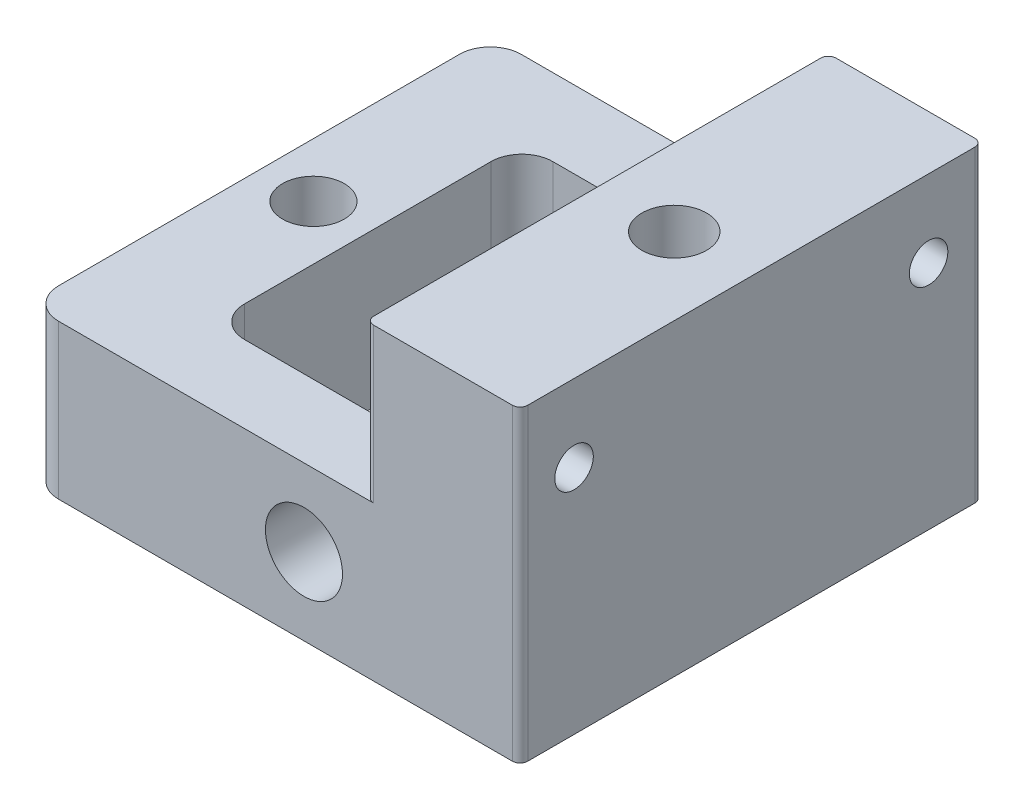
ISO-10303-21;
HEADER;
FILE_DESCRIPTION(('STEP AP214'),'2;1');
FILE_NAME('part.step','',(''),(''),'','','');
FILE_SCHEMA(('AUTOMOTIVE_DESIGN { 1 0 10303 214 1 1 1 1 }'));
ENDSEC;
DATA;
#1=APPLICATION_CONTEXT('core data for automotive mechanical design processes');
#2=APPLICATION_PROTOCOL_DEFINITION('international standard','automotive_design',2000,#1);
#3=PRODUCT_CONTEXT('',#1,'mechanical');
#4=PRODUCT('Part','Part','',(#3));
#5=PRODUCT_RELATED_PRODUCT_CATEGORY('part','',(#4));
#6=PRODUCT_DEFINITION_FORMATION('','',#4);
#7=PRODUCT_DEFINITION_CONTEXT('part definition',#1,'design');
#8=PRODUCT_DEFINITION('design','',#6,#7);
#9=PRODUCT_DEFINITION_SHAPE('','',#8);
#10=(LENGTH_UNIT() NAMED_UNIT(*) SI_UNIT(.MILLI.,.METRE.));
#11=(NAMED_UNIT(*) PLANE_ANGLE_UNIT() SI_UNIT($,.RADIAN.));
#12=(NAMED_UNIT(*) SI_UNIT($,.STERADIAN.) SOLID_ANGLE_UNIT());
#13=UNCERTAINTY_MEASURE_WITH_UNIT(LENGTH_MEASURE(1.E-05),#10,'distance_accuracy_value','');
#14=(GEOMETRIC_REPRESENTATION_CONTEXT(3) GLOBAL_UNCERTAINTY_ASSIGNED_CONTEXT((#13)) GLOBAL_UNIT_ASSIGNED_CONTEXT((#10,
#11,#12)) REPRESENTATION_CONTEXT('',''));
#15=CARTESIAN_POINT('',(0.,0.,0.));
#16=DIRECTION('',(0.,0.,1.));
#17=DIRECTION('',(1.,0.,0.));
#18=AXIS2_PLACEMENT_3D('',#15,#16,#17);
#19=CARTESIAN_POINT('',(5.44,10.,-8.));
#20=DIRECTION('',(0.,1.,0.));
#21=DIRECTION('',(0.,0.,1.));
#22=AXIS2_PLACEMENT_3D('',#19,#20,#21);
#23=CYLINDRICAL_SURFACE('',#22,2.);
#24=CARTESIAN_POINT('',(5.44,3.52704378883824,-10.));
#25=CARTESIAN_POINT('',(5.48104147351789,3.58331500033074,-9.99998850142255));
#26=CARTESIAN_POINT('',(5.51970486579926,3.64128959563261,-9.99873652645845));
#27=CARTESIAN_POINT('',(5.59202875055177,3.7601931502025,-9.99454527256372));
#28=CARTESIAN_POINT('',(5.62569127791035,3.82112089435457,-9.99160668230917));
#29=CARTESIAN_POINT('',(5.68782056180684,3.94556501522876,-9.984832363108));
#30=CARTESIAN_POINT('',(5.71628395876177,4.00908303354357,-9.98099605770029));
#31=CARTESIAN_POINT('',(5.7678176741094,4.13826480713069,-9.97312346739221));
#32=CARTESIAN_POINT('',(5.79088752633298,4.20392874731841,-9.96908716524244));
#33=CARTESIAN_POINT('',(5.8314755973979,4.33696092342867,-9.96142132507083));
#34=CARTESIAN_POINT('',(5.84899488261951,4.4043288292948,-9.95779170900279));
#35=CARTESIAN_POINT('',(5.87836212299287,4.54033165201067,-9.95142638505805));
#36=CARTESIAN_POINT('',(5.89021020499632,4.60896654048525,-9.94869065718759));
#37=CARTESIAN_POINT('',(5.90813180631112,4.74694922186335,-9.944463327643));
#38=CARTESIAN_POINT('',(5.91421163480861,4.81629615180461,-9.94297036687789));
#39=CARTESIAN_POINT('',(5.92056748558876,4.95527106060188,-9.94140819759608));
#40=CARTESIAN_POINT('',(5.92084361097174,5.02489903444328,-9.94133896378746));
#41=CARTESIAN_POINT('',(5.91561008453058,5.16338468110194,-9.9426276082071));
#42=CARTESIAN_POINT('',(5.91014508336507,5.23224415087903,-9.9439744730309));
#43=CARTESIAN_POINT('',(5.89354189799116,5.36926358175334,-9.94791483186192));
#44=CARTESIAN_POINT('',(5.88240156360279,5.43742326773585,-9.9505087983302));
#45=CARTESIAN_POINT('',(5.85452694412536,5.5725723707106,-9.95662231446084));
#46=CARTESIAN_POINT('',(5.83779082199904,5.63956139577792,-9.96014216800098));
#47=CARTESIAN_POINT('',(5.79884920989069,5.7719074873545,-9.96764294093793));
#48=CARTESIAN_POINT('',(5.77664210538313,5.83726406583517,-9.97162399625458));
#49=CARTESIAN_POINT('',(5.71252493957892,6.00306558749418,-9.98174582510828));
#50=CARTESIAN_POINT('',(5.66663571053796,6.10202435352298,-9.98780897311949));
#51=CARTESIAN_POINT('',(5.58846989590418,6.24527103891972,-9.99465155000532));
#52=CARTESIAN_POINT('',(5.56087999802196,6.29212626909717,-9.99655654948567));
#53=CARTESIAN_POINT('',(5.50267870880137,6.38398132372905,-9.99922950587539));
#54=CARTESIAN_POINT('',(5.47206602723758,6.42898034417135,-9.99999697499142));
#55=CARTESIAN_POINT('',(5.44,6.47295621116176,-10.));
#56=B_SPLINE_CURVE_WITH_KNOTS('',3,(#24,#25,#26,#27,#28,#29,#30,#31,#32,#33,#34,#35,#36,#37,#38,
#39,#40,#41,#42,#43,#44,#45,#46,#47,#48,#49,#50,#51,#52,#53,#54,#55),.UNSPECIFIED.,.F.,.F.,(4,2,
2,2,2,2,2,2,2,2,2,2,2,2,2,4),(0.,0.208837685711806,0.417590159750949,0.626477052274401,
0.835381992418413,1.04424677317261,1.25310688188606,1.46173827983796,1.67036597153886,
1.87738302443333,2.0844785670484,2.29164216377793,2.49886696933352,2.82552194118329,
2.98864010160041,3.15182818978092),.UNSPECIFIED.);
#57=CARTESIAN_POINT('',(5.44,3.52704378883824,-10.));
#58=VERTEX_POINT('',#57);
#59=CARTESIAN_POINT('',(5.44,6.47295621116176,-10.));
#60=VERTEX_POINT('',#59);
#61=EDGE_CURVE('E185',#58,#60,#56,.T.);
#62=ORIENTED_EDGE('',*,*,#61,.F.);
#63=DIRECTION('',(0.,-1.,0.));
#64=VECTOR('',#63,1.);
#65=CARTESIAN_POINT('',(5.44,10.,-10.));
#66=LINE('',#65,#64);
#67=CARTESIAN_POINT('',(5.44,0.,-10.));
#68=VERTEX_POINT('',#67);
#69=EDGE_CURVE('E194',#68,#58,#66,.F.);
#70=ORIENTED_EDGE('',*,*,#69,.F.);
#71=CARTESIAN_POINT('',(5.44,0.,-8.));
#72=DIRECTION('',(0.,1.,0.));
#73=DIRECTION('',(0.,0.,1.));
#74=AXIS2_PLACEMENT_3D('',#71,#72,#73);
#75=CIRCLE('',#74,2.);
#76=CARTESIAN_POINT('',(7.44,0.,-8.));
#77=VERTEX_POINT('',#76);
#78=EDGE_CURVE('E226',#77,#68,#75,.T.);
#79=ORIENTED_EDGE('',*,*,#78,.F.);
#80=DIRECTION('',(0.,-1.,0.));
#81=VECTOR('',#80,1.);
#82=CARTESIAN_POINT('',(7.44,0.,-8.));
#83=LINE('',#82,#81);
#84=CARTESIAN_POINT('',(7.44,10.,-8.));
#85=VERTEX_POINT('',#84);
#86=EDGE_CURVE('E215',#85,#77,#83,.T.);
#87=ORIENTED_EDGE('',*,*,#86,.F.);
#88=CARTESIAN_POINT('',(5.44,10.,-8.));
#89=DIRECTION('',(0.,1.,0.));
#90=DIRECTION('',(0.,0.,1.));
#91=AXIS2_PLACEMENT_3D('',#88,#89,#90);
#92=CIRCLE('',#91,2.);
#93=CARTESIAN_POINT('',(5.44,10.,-10.));
#94=VERTEX_POINT('',#93);
#95=EDGE_CURVE('E228',#94,#85,#92,.F.);
#96=ORIENTED_EDGE('',*,*,#95,.F.);
#97=EDGE_CURVE('E196',#60,#94,#66,.F.);
#98=ORIENTED_EDGE('',*,*,#97,.F.);
#99=EDGE_LOOP('',(#62,#70,#79,#87,#96,#98));
#100=FACE_BOUND('',#99,.T.);
#101=ADVANCED_FACE('F35',(#100),#23,.F.);
#102=CARTESIAN_POINT('',(5.44,10.,8.));
#103=DIRECTION('',(0.,1.,0.));
#104=DIRECTION('',(0.,0.,1.));
#105=AXIS2_PLACEMENT_3D('',#102,#103,#104);
#106=CYLINDRICAL_SURFACE('',#105,2.);
#107=CARTESIAN_POINT('',(5.44,6.47295621116176,10.));
#108=CARTESIAN_POINT('',(5.48104147351789,6.41668499966926,9.99998850142255));
#109=CARTESIAN_POINT('',(5.51970486579926,6.35871040436738,9.99873652645846));
#110=CARTESIAN_POINT('',(5.59202875055177,6.2398068497975,9.99454527256372));
#111=CARTESIAN_POINT('',(5.62569127791035,6.17887910564542,9.99160668230917));
#112=CARTESIAN_POINT('',(5.68782056180684,6.05443498477124,9.984832363108));
#113=CARTESIAN_POINT('',(5.71628395876177,5.99091696645643,9.98099605770029));
#114=CARTESIAN_POINT('',(5.7678176741094,5.86173519286931,9.97312346739221));
#115=CARTESIAN_POINT('',(5.79088752633298,5.79607125268159,9.96908716524244));
#116=CARTESIAN_POINT('',(5.8314755973979,5.66303907657133,9.96142132507083));
#117=CARTESIAN_POINT('',(5.84899488261951,5.59567117070519,9.95779170900279));
#118=CARTESIAN_POINT('',(5.87836212299287,5.45966834798933,9.95142638505806));
#119=CARTESIAN_POINT('',(5.89021020499632,5.39103345951475,9.94869065718759));
#120=CARTESIAN_POINT('',(5.90813180631112,5.25305077813665,9.94446332764301));
#121=CARTESIAN_POINT('',(5.91421163480861,5.18370384819539,9.9429703668779));
#122=CARTESIAN_POINT('',(5.92056748558876,5.04472893939812,9.94140819759608));
#123=CARTESIAN_POINT('',(5.92084361097174,4.97510096555672,9.94133896378746));
#124=CARTESIAN_POINT('',(5.91561008453058,4.83661531889805,9.9426276082071));
#125=CARTESIAN_POINT('',(5.91014508336507,4.76775584912096,9.9439744730309));
#126=CARTESIAN_POINT('',(5.89354189799116,4.63073641824666,9.94791483186192));
#127=CARTESIAN_POINT('',(5.88240156360279,4.56257673226415,9.9505087983302));
#128=CARTESIAN_POINT('',(5.85452694412536,4.42742762928939,9.95662231446084));
#129=CARTESIAN_POINT('',(5.83779082199904,4.36043860422207,9.96014216800098));
#130=CARTESIAN_POINT('',(5.79884920989069,4.2280925126455,9.96764294093793));
#131=CARTESIAN_POINT('',(5.77664210538313,4.16273593416482,9.97162399625458));
#132=CARTESIAN_POINT('',(5.71252493957892,3.99693441250582,9.98174582510828));
#133=CARTESIAN_POINT('',(5.66663571053796,3.89797564647702,9.98780897311949));
#134=CARTESIAN_POINT('',(5.58846989590418,3.75472896108028,9.99465155000532));
#135=CARTESIAN_POINT('',(5.56087999802196,3.70787373090283,9.99655654948567));
#136=CARTESIAN_POINT('',(5.50267870880137,3.61601867627095,9.99922950587539));
#137=CARTESIAN_POINT('',(5.47206602723758,3.57101965582865,9.99999697499142));
#138=CARTESIAN_POINT('',(5.44,3.52704378883824,10.));
#139=B_SPLINE_CURVE_WITH_KNOTS('',3,(#107,#108,#109,#110,#111,#112,#113,#114,#115,#116,#117,
#118,#119,#120,#121,#122,#123,#124,#125,#126,#127,#128,#129,#130,#131,#132,#133,#134,#135,#136,
#137,#138),.UNSPECIFIED.,.F.,.F.,(4,2,2,2,2,2,2,2,2,2,2,2,2,2,2,4),(0.,0.208837685711806,
0.417590159750949,0.626477052274402,0.835381992418414,1.04424677317261,1.25310688188606,
1.46173827983796,1.67036597153886,1.87738302443333,2.0844785670484,2.29164216377793,
2.49886696933352,2.82552194118329,2.98864010160041,3.15182818978092),.UNSPECIFIED.);
#140=CARTESIAN_POINT('',(5.44,6.47295621116176,10.));
#141=VERTEX_POINT('',#140);
#142=CARTESIAN_POINT('',(5.44,3.52704378883824,10.));
#143=VERTEX_POINT('',#142);
#144=EDGE_CURVE('E235',#141,#143,#139,.T.);
#145=ORIENTED_EDGE('',*,*,#144,.F.);
#146=DIRECTION('',(0.,-1.,0.));
#147=VECTOR('',#146,1.);
#148=CARTESIAN_POINT('',(5.44,0.,10.));
#149=LINE('',#148,#147);
#150=CARTESIAN_POINT('',(5.44,10.,10.));
#151=VERTEX_POINT('',#150);
#152=EDGE_CURVE('E425',#151,#141,#149,.T.);
#153=ORIENTED_EDGE('',*,*,#152,.F.);
#154=CARTESIAN_POINT('',(5.44,10.,8.));
#155=DIRECTION('',(0.,1.,0.));
#156=DIRECTION('',(0.,0.,1.));
#157=AXIS2_PLACEMENT_3D('',#154,#155,#156);
#158=CIRCLE('',#157,2.);
#159=CARTESIAN_POINT('',(7.44000000000001,10.,7.99999999999999));
#160=VERTEX_POINT('',#159);
#161=EDGE_CURVE('E233',#160,#151,#158,.F.);
#162=ORIENTED_EDGE('',*,*,#161,.F.);
#163=DIRECTION('',(0.,-1.,0.));
#164=VECTOR('',#163,1.);
#165=CARTESIAN_POINT('',(7.44,10.,8.));
#166=LINE('',#165,#164);
#167=CARTESIAN_POINT('',(7.44,0.,8.));
#168=VERTEX_POINT('',#167);
#169=EDGE_CURVE('E207',#168,#160,#166,.F.);
#170=ORIENTED_EDGE('',*,*,#169,.F.);
#171=CARTESIAN_POINT('',(5.44,0.,8.));
#172=DIRECTION('',(0.,1.,0.));
#173=DIRECTION('',(0.,0.,1.));
#174=AXIS2_PLACEMENT_3D('',#171,#172,#173);
#175=CIRCLE('',#174,2.);
#176=CARTESIAN_POINT('',(5.44,0.,10.));
#177=VERTEX_POINT('',#176);
#178=EDGE_CURVE('E231',#177,#168,#175,.T.);
#179=ORIENTED_EDGE('',*,*,#178,.F.);
#180=EDGE_CURVE('E424',#143,#177,#149,.T.);
#181=ORIENTED_EDGE('',*,*,#180,.F.);
#182=EDGE_LOOP('',(#145,#153,#162,#170,#179,#181));
#183=FACE_BOUND('',#182,.T.);
#184=ADVANCED_FACE('F245',(#183),#106,.F.);
#185=CARTESIAN_POINT('',(0.,10.,0.));
#186=DIRECTION('',(0.,1.,0.));
#187=DIRECTION('',(0.,0.,1.));
#188=AXIS2_PLACEMENT_3D('',#185,#186,#187);
#189=PLANE('',#188);
#190=CARTESIAN_POINT('',(-10.965,10.,0.));
#191=DIRECTION('',(0.,1.,0.));
#192=DIRECTION('',(0.,0.,1.));
#193=AXIS2_PLACEMENT_3D('',#190,#191,#192);
#194=CIRCLE('',#193,2.);
#195=CARTESIAN_POINT('',(-10.965,10.,2.));
#196=VERTEX_POINT('',#195);
#197=EDGE_CURVE('E539',#196,#196,#194,.T.);
#198=ORIENTED_EDGE('',*,*,#197,.F.);
#199=EDGE_LOOP('',(#198));
#200=FACE_BOUND('',#199,.T.);
#201=DIRECTION('',(-1.,0.,0.));
#202=VECTOR('',#201,1.);
#203=CARTESIAN_POINT('',(17.44,10.,-15.));
#204=LINE('',#203,#202);
#205=CARTESIAN_POINT('',(7.94,10.,-15.));
#206=VERTEX_POINT('',#205);
#207=CARTESIAN_POINT('',(-12.49,10.,-15.));
#208=VERTEX_POINT('',#207);
#209=EDGE_CURVE('E365',#206,#208,#204,.T.);
#210=ORIENTED_EDGE('',*,*,#209,.T.);
#211=CARTESIAN_POINT('',(-12.49,10.,-13.));
#212=DIRECTION('',(0.,1.,0.));
#213=DIRECTION('',(0.,0.,1.));
#214=AXIS2_PLACEMENT_3D('',#211,#212,#213);
#215=CIRCLE('',#214,2.);
#216=CARTESIAN_POINT('',(-14.49,10.,-13.));
#217=VERTEX_POINT('',#216);
#218=EDGE_CURVE('E467',#208,#217,#215,.T.);
#219=ORIENTED_EDGE('',*,*,#218,.T.);
#220=DIRECTION('',(0.,0.,1.));
#221=VECTOR('',#220,1.);
#222=CARTESIAN_POINT('',(-14.49,10.,15.));
#223=LINE('',#222,#221);
#224=CARTESIAN_POINT('',(-14.49,10.,13.));
#225=VERTEX_POINT('',#224);
#226=EDGE_CURVE('E404',#217,#225,#223,.T.);
#227=ORIENTED_EDGE('',*,*,#226,.T.);
#228=CARTESIAN_POINT('',(-12.49,10.,13.));
#229=DIRECTION('',(0.,1.,0.));
#230=DIRECTION('',(0.,0.,1.));
#231=AXIS2_PLACEMENT_3D('',#228,#229,#230);
#232=CIRCLE('',#231,2.);
#233=CARTESIAN_POINT('',(-12.49,10.,15.));
#234=VERTEX_POINT('',#233);
#235=EDGE_CURVE('E469',#225,#234,#232,.T.);
#236=ORIENTED_EDGE('',*,*,#235,.T.);
#237=DIRECTION('',(1.,0.,0.));
#238=VECTOR('',#237,1.);
#239=CARTESIAN_POINT('',(17.44,10.,15.));
#240=LINE('',#239,#238);
#241=CARTESIAN_POINT('',(7.94,10.,15.));
#242=VERTEX_POINT('',#241);
#243=EDGE_CURVE('E407',#234,#242,#240,.T.);
#244=ORIENTED_EDGE('',*,*,#243,.T.);
#245=CARTESIAN_POINT('',(7.94,10.,14.5));
#246=DIRECTION('',(0.,1.,0.));
#247=DIRECTION('',(0.,0.,1.));
#248=AXIS2_PLACEMENT_3D('',#245,#246,#247);
#249=CIRCLE('',#248,0.5);
#250=CARTESIAN_POINT('',(7.44000000000001,10.,14.5));
#251=VERTEX_POINT('',#250);
#252=EDGE_CURVE('E12',#242,#251,#249,.F.);
#253=ORIENTED_EDGE('',*,*,#252,.T.);
#254=DIRECTION('',(0.,0.,1.));
#255=VECTOR('',#254,1.);
#256=CARTESIAN_POINT('',(7.44,10.,-15.));
#257=LINE('',#256,#255);
#258=EDGE_CURVE('E384',#160,#251,#257,.T.);
#259=ORIENTED_EDGE('',*,*,#258,.F.);
#260=ORIENTED_EDGE('',*,*,#161,.T.);
#261=DIRECTION('',(1.,0.,0.));
#262=VECTOR('',#261,1.);
#263=CARTESIAN_POINT('',(7.44,10.,10.));
#264=LINE('',#263,#262);
#265=CARTESIAN_POINT('',(-5.44,10.,10.));
#266=VERTEX_POINT('',#265);
#267=EDGE_CURVE('E388',#266,#151,#264,.T.);
#268=ORIENTED_EDGE('',*,*,#267,.F.);
#269=CARTESIAN_POINT('',(-5.44,10.,8.00000000000001));
#270=DIRECTION('',(0.,1.,0.));
#271=DIRECTION('',(0.,0.,1.));
#272=AXIS2_PLACEMENT_3D('',#269,#270,#271);
#273=CIRCLE('',#272,2.);
#274=CARTESIAN_POINT('',(-7.44,10.,8.00000000000001));
#275=VERTEX_POINT('',#274);
#276=EDGE_CURVE('E220',#266,#275,#273,.F.);
#277=ORIENTED_EDGE('',*,*,#276,.T.);
#278=DIRECTION('',(0.,0.,1.));
#279=VECTOR('',#278,1.);
#280=CARTESIAN_POINT('',(-7.44,10.,10.));
#281=LINE('',#280,#279);
#282=CARTESIAN_POINT('',(-7.44,10.,-8.));
#283=VERTEX_POINT('',#282);
#284=EDGE_CURVE('E385',#283,#275,#281,.T.);
#285=ORIENTED_EDGE('',*,*,#284,.F.);
#286=CARTESIAN_POINT('',(-5.44,10.,-7.99999999999999));
#287=DIRECTION('',(0.,1.,0.));
#288=DIRECTION('',(0.,0.,1.));
#289=AXIS2_PLACEMENT_3D('',#286,#287,#288);
#290=CIRCLE('',#289,2.);
#291=CARTESIAN_POINT('',(-5.44,10.,-9.99999999999999));
#292=VERTEX_POINT('',#291);
#293=EDGE_CURVE('E224',#283,#292,#290,.F.);
#294=ORIENTED_EDGE('',*,*,#293,.T.);
#295=DIRECTION('',(-1.,0.,0.));
#296=VECTOR('',#295,1.);
#297=CARTESIAN_POINT('',(7.44,10.,-10.));
#298=LINE('',#297,#296);
#299=EDGE_CURVE('E391',#94,#292,#298,.T.);
#300=ORIENTED_EDGE('',*,*,#299,.F.);
#301=ORIENTED_EDGE('',*,*,#95,.T.);
#302=CARTESIAN_POINT('',(7.44,10.,-14.5));
#303=VERTEX_POINT('',#302);
#304=EDGE_CURVE('E367',#303,#85,#257,.T.);
#305=ORIENTED_EDGE('',*,*,#304,.F.);
#306=CARTESIAN_POINT('',(7.94,10.,-14.5));
#307=DIRECTION('',(0.,1.,0.));
#308=DIRECTION('',(0.,0.,1.));
#309=AXIS2_PLACEMENT_3D('',#306,#307,#308);
#310=CIRCLE('',#309,0.5);
#311=EDGE_CURVE('E43',#303,#206,#310,.F.);
#312=ORIENTED_EDGE('',*,*,#311,.T.);
#313=EDGE_LOOP('',(#210,#219,#227,#236,#244,#253,#259,#260,#268,#277,#285,#294,#300,#301,#305,#312));
#314=FACE_BOUND('',#313,.T.);
#315=ADVANCED_FACE('F298',(#200,#314),#189,.T.);
#316=CARTESIAN_POINT('',(0.,0.,0.));
#317=DIRECTION('',(0.,1.,0.));
#318=DIRECTION('',(0.,0.,1.));
#319=AXIS2_PLACEMENT_3D('',#316,#317,#318);
#320=PLANE('',#319);
#321=CARTESIAN_POINT('',(-10.965,0.,0.));
#322=DIRECTION('',(0.,1.,0.));
#323=DIRECTION('',(0.,0.,1.));
#324=AXIS2_PLACEMENT_3D('',#321,#322,#323);
#325=CIRCLE('',#324,2.);
#326=CARTESIAN_POINT('',(-10.965,0.,2.));
#327=VERTEX_POINT('',#326);
#328=EDGE_CURVE('E536',#327,#327,#325,.T.);
#329=ORIENTED_EDGE('',*,*,#328,.T.);
#330=EDGE_LOOP('',(#329));
#331=FACE_BOUND('',#330,.T.);
#332=CARTESIAN_POINT('',(12.44,0.,0.));
#333=DIRECTION('',(0.,1.,0.));
#334=DIRECTION('',(0.,0.,1.));
#335=AXIS2_PLACEMENT_3D('',#332,#333,#334);
#336=CIRCLE('',#335,2.1);
#337=CARTESIAN_POINT('',(12.44,0.,2.1));
#338=VERTEX_POINT('',#337);
#339=EDGE_CURVE('E383',#338,#338,#336,.T.);
#340=ORIENTED_EDGE('',*,*,#339,.T.);
#341=EDGE_LOOP('',(#340));
#342=FACE_BOUND('',#341,.T.);
#343=DIRECTION('',(0.,0.,-1.));
#344=VECTOR('',#343,1.);
#345=CARTESIAN_POINT('',(17.44,0.,15.));
#346=LINE('',#345,#344);
#347=CARTESIAN_POINT('',(17.44,0.,14.5));
#348=VERTEX_POINT('',#347);
#349=CARTESIAN_POINT('',(17.44,0.,-14.5));
#350=VERTEX_POINT('',#349);
#351=EDGE_CURVE('E416',#348,#350,#346,.T.);
#352=ORIENTED_EDGE('',*,*,#351,.F.);
#353=CARTESIAN_POINT('',(16.94,0.,14.5));
#354=DIRECTION('',(0.,1.,0.));
#355=DIRECTION('',(0.,0.,1.));
#356=AXIS2_PLACEMENT_3D('',#353,#354,#355);
#357=CIRCLE('',#356,0.5);
#358=CARTESIAN_POINT('',(16.94,0.,15.));
#359=VERTEX_POINT('',#358);
#360=EDGE_CURVE('E457',#348,#359,#357,.F.);
#361=ORIENTED_EDGE('',*,*,#360,.T.);
#362=DIRECTION('',(1.,0.,0.));
#363=VECTOR('',#362,1.);
#364=CARTESIAN_POINT('',(17.44,0.,15.));
#365=LINE('',#364,#363);
#366=CARTESIAN_POINT('',(-12.49,0.,15.));
#367=VERTEX_POINT('',#366);
#368=EDGE_CURVE('E413',#367,#359,#365,.T.);
#369=ORIENTED_EDGE('',*,*,#368,.F.);
#370=CARTESIAN_POINT('',(-12.49,0.,13.));
#371=DIRECTION('',(0.,1.,0.));
#372=DIRECTION('',(0.,0.,1.));
#373=AXIS2_PLACEMENT_3D('',#370,#371,#372);
#374=CIRCLE('',#373,2.);
#375=CARTESIAN_POINT('',(-14.49,0.,13.));
#376=VERTEX_POINT('',#375);
#377=EDGE_CURVE('E476',#367,#376,#374,.F.);
#378=ORIENTED_EDGE('',*,*,#377,.T.);
#379=DIRECTION('',(0.,0.,1.));
#380=VECTOR('',#379,1.);
#381=CARTESIAN_POINT('',(-14.49,0.,15.));
#382=LINE('',#381,#380);
#383=CARTESIAN_POINT('',(-14.49,0.,-13.));
#384=VERTEX_POINT('',#383);
#385=EDGE_CURVE('E394',#384,#376,#382,.T.);
#386=ORIENTED_EDGE('',*,*,#385,.F.);
#387=CARTESIAN_POINT('',(-12.49,0.,-13.));
#388=DIRECTION('',(0.,1.,0.));
#389=DIRECTION('',(0.,0.,1.));
#390=AXIS2_PLACEMENT_3D('',#387,#388,#389);
#391=CIRCLE('',#390,2.);
#392=CARTESIAN_POINT('',(-12.49,0.,-15.));
#393=VERTEX_POINT('',#392);
#394=EDGE_CURVE('E473',#384,#393,#391,.F.);
#395=ORIENTED_EDGE('',*,*,#394,.T.);
#396=DIRECTION('',(-1.,0.,0.));
#397=VECTOR('',#396,1.);
#398=CARTESIAN_POINT('',(17.44,0.,-15.));
#399=LINE('',#398,#397);
#400=CARTESIAN_POINT('',(16.94,0.,-15.));
#401=VERTEX_POINT('',#400);
#402=EDGE_CURVE('E408',#401,#393,#399,.T.);
#403=ORIENTED_EDGE('',*,*,#402,.F.);
#404=CARTESIAN_POINT('',(16.94,0.,-14.5));
#405=DIRECTION('',(0.,1.,0.));
#406=DIRECTION('',(0.,0.,1.));
#407=AXIS2_PLACEMENT_3D('',#404,#405,#406);
#408=CIRCLE('',#407,0.5);
#409=EDGE_CURVE('E459',#401,#350,#408,.F.);
#410=ORIENTED_EDGE('',*,*,#409,.T.);
#411=EDGE_LOOP('',(#352,#361,#369,#378,#386,#395,#403,#410));
#412=FACE_BOUND('',#411,.T.);
#413=DIRECTION('',(-1.,0.,0.));
#414=VECTOR('',#413,1.);
#415=CARTESIAN_POINT('',(7.44,0.,-10.));
#416=LINE('',#415,#414);
#417=CARTESIAN_POINT('',(-5.44,0.,-9.99999999999999));
#418=VERTEX_POINT('',#417);
#419=EDGE_CURVE('E204',#68,#418,#416,.T.);
#420=ORIENTED_EDGE('',*,*,#419,.T.);
#421=CARTESIAN_POINT('',(-5.44,0.,-7.99999999999999));
#422=DIRECTION('',(0.,1.,0.));
#423=DIRECTION('',(0.,0.,1.));
#424=AXIS2_PLACEMENT_3D('',#421,#422,#423);
#425=CIRCLE('',#424,2.);
#426=CARTESIAN_POINT('',(-7.44,0.,-8.));
#427=VERTEX_POINT('',#426);
#428=EDGE_CURVE('E222',#418,#427,#425,.T.);
#429=ORIENTED_EDGE('',*,*,#428,.T.);
#430=DIRECTION('',(0.,0.,1.));
#431=VECTOR('',#430,1.);
#432=CARTESIAN_POINT('',(-7.44,0.,10.));
#433=LINE('',#432,#431);
#434=CARTESIAN_POINT('',(-7.44,0.,8.00000000000001));
#435=VERTEX_POINT('',#434);
#436=EDGE_CURVE('E339',#427,#435,#433,.T.);
#437=ORIENTED_EDGE('',*,*,#436,.T.);
#438=CARTESIAN_POINT('',(-5.44,0.,8.00000000000001));
#439=DIRECTION('',(0.,1.,0.));
#440=DIRECTION('',(0.,0.,1.));
#441=AXIS2_PLACEMENT_3D('',#438,#439,#440);
#442=CIRCLE('',#441,2.);
#443=CARTESIAN_POINT('',(-5.44,0.,10.));
#444=VERTEX_POINT('',#443);
#445=EDGE_CURVE('E218',#435,#444,#442,.T.);
#446=ORIENTED_EDGE('',*,*,#445,.T.);
#447=DIRECTION('',(1.,0.,0.));
#448=VECTOR('',#447,1.);
#449=CARTESIAN_POINT('',(7.44,0.,10.));
#450=LINE('',#449,#448);
#451=EDGE_CURVE('E397',#444,#177,#450,.T.);
#452=ORIENTED_EDGE('',*,*,#451,.T.);
#453=ORIENTED_EDGE('',*,*,#178,.T.);
#454=DIRECTION('',(0.,0.,-1.));
#455=VECTOR('',#454,1.);
#456=CARTESIAN_POINT('',(7.44,0.,10.));
#457=LINE('',#456,#455);
#458=EDGE_CURVE('E400',#168,#77,#457,.T.);
#459=ORIENTED_EDGE('',*,*,#458,.T.);
#460=ORIENTED_EDGE('',*,*,#78,.T.);
#461=EDGE_LOOP('',(#420,#429,#437,#446,#452,#453,#459,#460));
#462=FACE_BOUND('',#461,.T.);
#463=ADVANCED_FACE('F282',(#331,#342,#412,#462),#320,.F.);
#464=CARTESIAN_POINT('',(-14.49,10.,15.));
#465=DIRECTION('',(1.,0.,0.));
#466=DIRECTION('',(0.,0.,-1.));
#467=AXIS2_PLACEMENT_3D('',#464,#465,#466);
#468=PLANE('',#467);
#469=ORIENTED_EDGE('',*,*,#226,.F.);
#470=DIRECTION('',(0.,-1.,0.));
#471=VECTOR('',#470,1.);
#472=CARTESIAN_POINT('',(-14.49,10.,-13.));
#473=LINE('',#472,#471);
#474=EDGE_CURVE('E477',#217,#384,#473,.T.);
#475=ORIENTED_EDGE('',*,*,#474,.T.);
#476=ORIENTED_EDGE('',*,*,#385,.T.);
#477=DIRECTION('',(0.,-1.,0.));
#478=VECTOR('',#477,1.);
#479=CARTESIAN_POINT('',(-14.49,10.,13.));
#480=LINE('',#479,#478);
#481=EDGE_CURVE('E243',#376,#225,#480,.F.);
#482=ORIENTED_EDGE('',*,*,#481,.T.);
#483=EDGE_LOOP('',(#469,#475,#476,#482));
#484=FACE_BOUND('',#483,.T.);
#485=ADVANCED_FACE('F278',(#484),#468,.F.);
#486=CARTESIAN_POINT('',(17.44,10.,15.));
#487=DIRECTION('',(0.,0.,-1.));
#488=DIRECTION('',(-1.,0.,0.));
#489=AXIS2_PLACEMENT_3D('',#486,#487,#488);
#490=PLANE('',#489);
#491=CARTESIAN_POINT('',(3.42,5.,15.));
#492=DIRECTION('',(0.,0.,1.));
#493=DIRECTION('',(1.,0.,0.));
#494=AXIS2_PLACEMENT_3D('',#491,#492,#493);
#495=CIRCLE('',#494,2.5);
#496=CARTESIAN_POINT('',(5.92,5.,15.));
#497=VERTEX_POINT('',#496);
#498=EDGE_CURVE('E189',#497,#497,#495,.T.);
#499=ORIENTED_EDGE('',*,*,#498,.F.);
#500=EDGE_LOOP('',(#499));
#501=FACE_BOUND('',#500,.T.);
#502=ORIENTED_EDGE('',*,*,#368,.T.);
#503=DIRECTION('',(0.,-1.,0.));
#504=VECTOR('',#503,1.);
#505=CARTESIAN_POINT('',(16.94,10.,15.));
#506=LINE('',#505,#504);
#507=CARTESIAN_POINT('',(16.94,20.,15.));
#508=VERTEX_POINT('',#507);
#509=EDGE_CURVE('E346',#359,#508,#506,.F.);
#510=ORIENTED_EDGE('',*,*,#509,.T.);
#511=DIRECTION('',(1.,0.,0.));
#512=VECTOR('',#511,1.);
#513=CARTESIAN_POINT('',(17.44,20.,15.));
#514=LINE('',#513,#512);
#515=CARTESIAN_POINT('',(7.94,20.,15.));
#516=VERTEX_POINT('',#515);
#517=EDGE_CURVE('E328',#516,#508,#514,.T.);
#518=ORIENTED_EDGE('',*,*,#517,.F.);
#519=DIRECTION('',(0.,-1.,0.));
#520=VECTOR('',#519,1.);
#521=CARTESIAN_POINT('',(7.94,10.,15.));
#522=LINE('',#521,#520);
#523=EDGE_CURVE('E452',#516,#242,#522,.T.);
#524=ORIENTED_EDGE('',*,*,#523,.T.);
#525=ORIENTED_EDGE('',*,*,#243,.F.);
#526=DIRECTION('',(0.,-1.,0.));
#527=VECTOR('',#526,1.);
#528=CARTESIAN_POINT('',(-12.49,10.,15.));
#529=LINE('',#528,#527);
#530=EDGE_CURVE('E464',#234,#367,#529,.T.);
#531=ORIENTED_EDGE('',*,*,#530,.T.);
#532=EDGE_LOOP('',(#502,#510,#518,#524,#525,#531));
#533=FACE_BOUND('',#532,.T.);
#534=ADVANCED_FACE('F281',(#501,#533),#490,.F.);
#535=CARTESIAN_POINT('',(17.44,10.,15.));
#536=DIRECTION('',(-1.,0.,0.));
#537=DIRECTION('',(0.,0.,1.));
#538=AXIS2_PLACEMENT_3D('',#535,#536,#537);
#539=PLANE('',#538);
#540=CARTESIAN_POINT('',(17.44,15.,-11.5));
#541=DIRECTION('',(-1.,0.,0.));
#542=DIRECTION('',(0.,0.,1.));
#543=AXIS2_PLACEMENT_3D('',#540,#541,#542);
#544=CIRCLE('',#543,1.25);
#545=CARTESIAN_POINT('',(17.44,15.,-10.25));
#546=VERTEX_POINT('',#545);
#547=EDGE_CURVE('E546',#546,#546,#544,.T.);
#548=ORIENTED_EDGE('',*,*,#547,.T.);
#549=EDGE_LOOP('',(#548));
#550=FACE_BOUND('',#549,.T.);
#551=CARTESIAN_POINT('',(17.44,15.,11.5));
#552=DIRECTION('',(-1.,0.,0.));
#553=DIRECTION('',(0.,0.,1.));
#554=AXIS2_PLACEMENT_3D('',#551,#552,#553);
#555=CIRCLE('',#554,1.25);
#556=CARTESIAN_POINT('',(17.44,15.,12.75));
#557=VERTEX_POINT('',#556);
#558=EDGE_CURVE('E552',#557,#557,#555,.T.);
#559=ORIENTED_EDGE('',*,*,#558,.T.);
#560=EDGE_LOOP('',(#559));
#561=FACE_BOUND('',#560,.T.);
#562=DIRECTION('',(0.,0.,-1.));
#563=VECTOR('',#562,1.);
#564=CARTESIAN_POINT('',(17.44,20.,-15.));
#565=LINE('',#564,#563);
#566=CARTESIAN_POINT('',(17.44,20.,14.5));
#567=VERTEX_POINT('',#566);
#568=CARTESIAN_POINT('',(17.44,20.,-14.5));
#569=VERTEX_POINT('',#568);
#570=EDGE_CURVE('E377',#567,#569,#565,.T.);
#571=ORIENTED_EDGE('',*,*,#570,.F.);
#572=DIRECTION('',(0.,-1.,0.));
#573=VECTOR('',#572,1.);
#574=CARTESIAN_POINT('',(17.44,10.,14.5));
#575=LINE('',#574,#573);
#576=EDGE_CURVE('E348',#567,#348,#575,.T.);
#577=ORIENTED_EDGE('',*,*,#576,.T.);
#578=ORIENTED_EDGE('',*,*,#351,.T.);
#579=DIRECTION('',(0.,-1.,0.));
#580=VECTOR('',#579,1.);
#581=CARTESIAN_POINT('',(17.44,10.,-14.5));
#582=LINE('',#581,#580);
#583=EDGE_CURVE('E462',#350,#569,#582,.F.);
#584=ORIENTED_EDGE('',*,*,#583,.T.);
#585=EDGE_LOOP('',(#571,#577,#578,#584));
#586=FACE_BOUND('',#585,.T.);
#587=ADVANCED_FACE('F286',(#550,#561,#586),#539,.F.);
#588=CARTESIAN_POINT('',(17.44,10.,-15.));
#589=DIRECTION('',(0.,0.,1.));
#590=DIRECTION('',(1.,0.,0.));
#591=AXIS2_PLACEMENT_3D('',#588,#589,#590);
#592=PLANE('',#591);
#593=CARTESIAN_POINT('',(3.42,5.,-15.));
#594=DIRECTION('',(0.,0.,1.));
#595=DIRECTION('',(1.,0.,0.));
#596=AXIS2_PLACEMENT_3D('',#593,#594,#595);
#597=CIRCLE('',#596,1.65);
#598=CARTESIAN_POINT('',(5.07,5.,-15.));
#599=VERTEX_POINT('',#598);
#600=EDGE_CURVE('E190',#599,#599,#597,.T.);
#601=ORIENTED_EDGE('',*,*,#600,.T.);
#602=EDGE_LOOP('',(#601));
#603=FACE_BOUND('',#602,.T.);
#604=DIRECTION('',(-1.,0.,0.));
#605=VECTOR('',#604,1.);
#606=CARTESIAN_POINT('',(17.44,20.,-15.));
#607=LINE('',#606,#605);
#608=CARTESIAN_POINT('',(16.94,20.,-15.));
#609=VERTEX_POINT('',#608);
#610=CARTESIAN_POINT('',(7.94,20.,-15.));
#611=VERTEX_POINT('',#610);
#612=EDGE_CURVE('E373',#609,#611,#607,.T.);
#613=ORIENTED_EDGE('',*,*,#612,.F.);
#614=DIRECTION('',(0.,-1.,0.));
#615=VECTOR('',#614,1.);
#616=CARTESIAN_POINT('',(16.94,10.,-15.));
#617=LINE('',#616,#615);
#618=EDGE_CURVE('E352',#609,#401,#617,.T.);
#619=ORIENTED_EDGE('',*,*,#618,.T.);
#620=ORIENTED_EDGE('',*,*,#402,.T.);
#621=DIRECTION('',(0.,-1.,0.));
#622=VECTOR('',#621,1.);
#623=CARTESIAN_POINT('',(-12.49,10.,-15.));
#624=LINE('',#623,#622);
#625=EDGE_CURVE('E471',#393,#208,#624,.F.);
#626=ORIENTED_EDGE('',*,*,#625,.T.);
#627=ORIENTED_EDGE('',*,*,#209,.F.);
#628=DIRECTION('',(0.,-1.,0.));
#629=VECTOR('',#628,1.);
#630=CARTESIAN_POINT('',(7.94,20.,-15.));
#631=LINE('',#630,#629);
#632=EDGE_CURVE('E349',#206,#611,#631,.F.);
#633=ORIENTED_EDGE('',*,*,#632,.T.);
#634=EDGE_LOOP('',(#613,#619,#620,#626,#627,#633));
#635=FACE_BOUND('',#634,.T.);
#636=ADVANCED_FACE('F290',(#603,#635),#592,.F.);
#637=CARTESIAN_POINT('',(-7.44,10.,10.));
#638=DIRECTION('',(1.,0.,0.));
#639=DIRECTION('',(0.,0.,-1.));
#640=AXIS2_PLACEMENT_3D('',#637,#638,#639);
#641=PLANE('',#640);
#642=ORIENTED_EDGE('',*,*,#284,.T.);
#643=DIRECTION('',(0.,-1.,0.));
#644=VECTOR('',#643,1.);
#645=CARTESIAN_POINT('',(-7.44,0.,8.00000000000001));
#646=LINE('',#645,#644);
#647=EDGE_CURVE('E422',#275,#435,#646,.T.);
#648=ORIENTED_EDGE('',*,*,#647,.T.);
#649=ORIENTED_EDGE('',*,*,#436,.F.);
#650=DIRECTION('',(0.,-1.,0.));
#651=VECTOR('',#650,1.);
#652=CARTESIAN_POINT('',(-7.44,10.,-7.99999999999999));
#653=LINE('',#652,#651);
#654=EDGE_CURVE('E420',#427,#283,#653,.F.);
#655=ORIENTED_EDGE('',*,*,#654,.T.);
#656=EDGE_LOOP('',(#642,#648,#649,#655));
#657=FACE_BOUND('',#656,.T.);
#658=ADVANCED_FACE('F294',(#657),#641,.T.);
#659=CARTESIAN_POINT('',(7.44,10.,10.));
#660=DIRECTION('',(0.,0.,-1.));
#661=DIRECTION('',(-1.,0.,0.));
#662=AXIS2_PLACEMENT_3D('',#659,#660,#661);
#663=PLANE('',#662);
#664=ORIENTED_EDGE('',*,*,#152,.T.);
#665=CARTESIAN_POINT('',(3.42,5.,10.));
#666=DIRECTION('',(0.,0.,-1.));
#667=DIRECTION('',(-1.,0.,0.));
#668=AXIS2_PLACEMENT_3D('',#665,#666,#667);
#669=CIRCLE('',#668,2.5);
#670=EDGE_CURVE('E198',#141,#143,#669,.F.);
#671=ORIENTED_EDGE('',*,*,#670,.T.);
#672=ORIENTED_EDGE('',*,*,#180,.T.);
#673=ORIENTED_EDGE('',*,*,#451,.F.);
#674=DIRECTION('',(0.,-1.,0.));
#675=VECTOR('',#674,1.);
#676=CARTESIAN_POINT('',(-5.44,10.,10.));
#677=LINE('',#676,#675);
#678=EDGE_CURVE('E209',#444,#266,#677,.F.);
#679=ORIENTED_EDGE('',*,*,#678,.T.);
#680=ORIENTED_EDGE('',*,*,#267,.T.);
#681=EDGE_LOOP('',(#664,#671,#672,#673,#679,#680));
#682=FACE_BOUND('',#681,.T.);
#683=ADVANCED_FACE('F305',(#682),#663,.T.);
#684=CARTESIAN_POINT('',(7.44,10.,10.));
#685=DIRECTION('',(-1.,0.,0.));
#686=DIRECTION('',(0.,0.,1.));
#687=AXIS2_PLACEMENT_3D('',#684,#685,#686);
#688=PLANE('',#687);
#689=CARTESIAN_POINT('',(7.44,15.,-11.5));
#690=DIRECTION('',(-1.,0.,0.));
#691=DIRECTION('',(0.,0.,1.));
#692=AXIS2_PLACEMENT_3D('',#689,#690,#691);
#693=CIRCLE('',#692,1.25);
#694=CARTESIAN_POINT('',(7.44,15.,-10.25));
#695=VERTEX_POINT('',#694);
#696=EDGE_CURVE('E541',#695,#695,#693,.T.);
#697=ORIENTED_EDGE('',*,*,#696,.F.);
#698=EDGE_LOOP('',(#697));
#699=FACE_BOUND('',#698,.T.);
#700=CARTESIAN_POINT('',(7.44,15.,11.5));
#701=DIRECTION('',(-1.,0.,0.));
#702=DIRECTION('',(0.,0.,1.));
#703=AXIS2_PLACEMENT_3D('',#700,#701,#702);
#704=CIRCLE('',#703,1.25);
#705=CARTESIAN_POINT('',(7.44,15.,12.75));
#706=VERTEX_POINT('',#705);
#707=EDGE_CURVE('E549',#706,#706,#704,.T.);
#708=ORIENTED_EDGE('',*,*,#707,.F.);
#709=EDGE_LOOP('',(#708));
#710=FACE_BOUND('',#709,.T.);
#711=DIRECTION('',(0.,0.,1.));
#712=VECTOR('',#711,1.);
#713=CARTESIAN_POINT('',(7.44,20.,-15.));
#714=LINE('',#713,#712);
#715=CARTESIAN_POINT('',(7.44,20.,-14.5));
#716=VERTEX_POINT('',#715);
#717=CARTESIAN_POINT('',(7.44000000000001,20.,14.5));
#718=VERTEX_POINT('',#717);
#719=EDGE_CURVE('E340',#716,#718,#714,.T.);
#720=ORIENTED_EDGE('',*,*,#719,.F.);
#721=DIRECTION('',(0.,-1.,0.));
#722=VECTOR('',#721,1.);
#723=CARTESIAN_POINT('',(7.44,10.,-14.5));
#724=LINE('',#723,#722);
#725=EDGE_CURVE('E362',#716,#303,#724,.T.);
#726=ORIENTED_EDGE('',*,*,#725,.T.);
#727=ORIENTED_EDGE('',*,*,#304,.T.);
#728=ORIENTED_EDGE('',*,*,#86,.T.);
#729=ORIENTED_EDGE('',*,*,#458,.F.);
#730=ORIENTED_EDGE('',*,*,#169,.T.);
#731=ORIENTED_EDGE('',*,*,#258,.T.);
#732=DIRECTION('',(0.,-1.,0.));
#733=VECTOR('',#732,1.);
#734=CARTESIAN_POINT('',(7.44,20.,14.5));
#735=LINE('',#734,#733);
#736=EDGE_CURVE('E360',#251,#718,#735,.F.);
#737=ORIENTED_EDGE('',*,*,#736,.T.);
#738=EDGE_LOOP('',(#720,#726,#727,#728,#729,#730,#731,#737));
#739=FACE_BOUND('',#738,.T.);
#740=ADVANCED_FACE('F309',(#699,#710,#739),#688,.T.);
#741=CARTESIAN_POINT('',(7.44,10.,-10.));
#742=DIRECTION('',(0.,0.,1.));
#743=DIRECTION('',(1.,0.,0.));
#744=AXIS2_PLACEMENT_3D('',#741,#742,#743);
#745=PLANE('',#744);
#746=CARTESIAN_POINT('',(3.42,5.,-10.));
#747=DIRECTION('',(0.,0.,1.));
#748=DIRECTION('',(1.,0.,0.));
#749=AXIS2_PLACEMENT_3D('',#746,#747,#748);
#750=CIRCLE('',#749,1.65);
#751=CARTESIAN_POINT('',(5.07,5.,-10.));
#752=VERTEX_POINT('',#751);
#753=EDGE_CURVE('E555',#752,#752,#750,.T.);
#754=ORIENTED_EDGE('',*,*,#753,.F.);
#755=EDGE_LOOP('',(#754));
#756=FACE_BOUND('',#755,.T.);
#757=ORIENTED_EDGE('',*,*,#69,.T.);
#758=CARTESIAN_POINT('',(3.42,5.,-10.));
#759=DIRECTION('',(0.,0.,1.));
#760=DIRECTION('',(1.,0.,0.));
#761=AXIS2_PLACEMENT_3D('',#758,#759,#760);
#762=CIRCLE('',#761,2.5);
#763=EDGE_CURVE('E182',#58,#60,#762,.T.);
#764=ORIENTED_EDGE('',*,*,#763,.T.);
#765=ORIENTED_EDGE('',*,*,#97,.T.);
#766=ORIENTED_EDGE('',*,*,#299,.T.);
#767=DIRECTION('',(0.,-1.,0.));
#768=VECTOR('',#767,1.);
#769=CARTESIAN_POINT('',(-5.44,0.,-9.99999999999999));
#770=LINE('',#769,#768);
#771=EDGE_CURVE('E205',#292,#418,#770,.T.);
#772=ORIENTED_EDGE('',*,*,#771,.T.);
#773=ORIENTED_EDGE('',*,*,#419,.F.);
#774=EDGE_LOOP('',(#757,#764,#765,#766,#772,#773));
#775=FACE_BOUND('',#774,.T.);
#776=ADVANCED_FACE('F201',(#756,#775),#745,.T.);
#777=CARTESIAN_POINT('',(0.,20.,0.));
#778=DIRECTION('',(0.,-1.,0.));
#779=DIRECTION('',(0.,0.,-1.));
#780=AXIS2_PLACEMENT_3D('',#777,#778,#779);
#781=PLANE('',#780);
#782=CARTESIAN_POINT('',(12.44,20.,0.));
#783=DIRECTION('',(0.,1.,0.));
#784=DIRECTION('',(0.,0.,1.));
#785=AXIS2_PLACEMENT_3D('',#782,#783,#784);
#786=CIRCLE('',#785,2.1);
#787=CARTESIAN_POINT('',(12.44,20.,2.1));
#788=VERTEX_POINT('',#787);
#789=EDGE_CURVE('E197',#788,#788,#786,.T.);
#790=ORIENTED_EDGE('',*,*,#789,.F.);
#791=EDGE_LOOP('',(#790));
#792=FACE_BOUND('',#791,.T.);
#793=ORIENTED_EDGE('',*,*,#517,.T.);
#794=CARTESIAN_POINT('',(16.94,20.,14.5));
#795=DIRECTION('',(0.,-1.,0.));
#796=DIRECTION('',(0.,0.,-1.));
#797=AXIS2_PLACEMENT_3D('',#794,#795,#796);
#798=CIRCLE('',#797,0.5);
#799=EDGE_CURVE('E331',#508,#567,#798,.F.);
#800=ORIENTED_EDGE('',*,*,#799,.T.);
#801=ORIENTED_EDGE('',*,*,#570,.T.);
#802=CARTESIAN_POINT('',(16.94,20.,-14.5));
#803=DIRECTION('',(0.,-1.,0.));
#804=DIRECTION('',(0.,0.,-1.));
#805=AXIS2_PLACEMENT_3D('',#802,#803,#804);
#806=CIRCLE('',#805,0.5);
#807=EDGE_CURVE('E350',#569,#609,#806,.F.);
#808=ORIENTED_EDGE('',*,*,#807,.T.);
#809=ORIENTED_EDGE('',*,*,#612,.T.);
#810=CARTESIAN_POINT('',(7.94,20.,-14.5));
#811=DIRECTION('',(0.,-1.,0.));
#812=DIRECTION('',(0.,0.,-1.));
#813=AXIS2_PLACEMENT_3D('',#810,#811,#812);
#814=CIRCLE('',#813,0.5);
#815=EDGE_CURVE('E354',#611,#716,#814,.F.);
#816=ORIENTED_EDGE('',*,*,#815,.T.);
#817=ORIENTED_EDGE('',*,*,#719,.T.);
#818=CARTESIAN_POINT('',(7.94,20.,14.5));
#819=DIRECTION('',(0.,-1.,0.));
#820=DIRECTION('',(0.,0.,-1.));
#821=AXIS2_PLACEMENT_3D('',#818,#819,#820);
#822=CIRCLE('',#821,0.5);
#823=EDGE_CURVE('E335',#718,#516,#822,.F.);
#824=ORIENTED_EDGE('',*,*,#823,.T.);
#825=EDGE_LOOP('',(#793,#800,#801,#808,#809,#816,#817,#824));
#826=FACE_BOUND('',#825,.T.);
#827=ADVANCED_FACE('F315',(#792,#826),#781,.F.);
#828=CARTESIAN_POINT('',(12.44,20.,0.));
#829=DIRECTION('',(0.,1.,0.));
#830=DIRECTION('',(0.,0.,1.));
#831=AXIS2_PLACEMENT_3D('',#828,#829,#830);
#832=CYLINDRICAL_SURFACE('',#831,2.1);
#833=ORIENTED_EDGE('',*,*,#339,.F.);
#834=EDGE_LOOP('',(#833));
#835=FACE_BOUND('',#834,.T.);
#836=ORIENTED_EDGE('',*,*,#789,.T.);
#837=EDGE_LOOP('',(#836));
#838=FACE_BOUND('',#837,.T.);
#839=ADVANCED_FACE('F258',(#835,#838),#832,.F.);
#840=CARTESIAN_POINT('',(-5.44,10.,8.00000000000001));
#841=DIRECTION('',(0.,1.,0.));
#842=DIRECTION('',(0.,0.,1.));
#843=AXIS2_PLACEMENT_3D('',#840,#841,#842);
#844=CYLINDRICAL_SURFACE('',#843,2.);
#845=ORIENTED_EDGE('',*,*,#276,.F.);
#846=ORIENTED_EDGE('',*,*,#678,.F.);
#847=ORIENTED_EDGE('',*,*,#445,.F.);
#848=ORIENTED_EDGE('',*,*,#647,.F.);
#849=EDGE_LOOP('',(#845,#846,#847,#848));
#850=FACE_BOUND('',#849,.T.);
#851=ADVANCED_FACE('F273',(#850),#844,.F.);
#852=CARTESIAN_POINT('',(-5.44,10.,-7.99999999999999));
#853=DIRECTION('',(0.,1.,0.));
#854=DIRECTION('',(0.,0.,1.));
#855=AXIS2_PLACEMENT_3D('',#852,#853,#854);
#856=CYLINDRICAL_SURFACE('',#855,2.);
#857=ORIENTED_EDGE('',*,*,#293,.F.);
#858=ORIENTED_EDGE('',*,*,#654,.F.);
#859=ORIENTED_EDGE('',*,*,#428,.F.);
#860=ORIENTED_EDGE('',*,*,#771,.F.);
#861=EDGE_LOOP('',(#857,#858,#859,#860));
#862=FACE_BOUND('',#861,.T.);
#863=ADVANCED_FACE('F254',(#862),#856,.F.);
#864=CARTESIAN_POINT('',(3.42,5.,15.));
#865=DIRECTION('',(0.,0.,-1.));
#866=DIRECTION('',(-1.,0.,0.));
#867=AXIS2_PLACEMENT_3D('',#864,#865,#866);
#868=CYLINDRICAL_SURFACE('',#867,2.5);
#869=ORIENTED_EDGE('',*,*,#144,.T.);
#870=ORIENTED_EDGE('',*,*,#670,.F.);
#871=EDGE_LOOP('',(#869,#870));
#872=FACE_BOUND('',#871,.T.);
#873=ORIENTED_EDGE('',*,*,#498,.T.);
#874=EDGE_LOOP('',(#873));
#875=FACE_BOUND('',#874,.T.);
#876=ADVANCED_FACE('F249',(#872,#875),#868,.F.);
#877=ORIENTED_EDGE('',*,*,#61,.T.);
#878=ORIENTED_EDGE('',*,*,#763,.F.);
#879=EDGE_LOOP('',(#877,#878));
#880=FACE_BOUND('',#879,.T.);
#881=ADVANCED_FACE('F184',(#880),#868,.F.);
#882=CARTESIAN_POINT('',(3.42,5.,-10.));
#883=DIRECTION('',(0.,0.,1.));
#884=DIRECTION('',(1.,0.,0.));
#885=AXIS2_PLACEMENT_3D('',#882,#883,#884);
#886=CYLINDRICAL_SURFACE('',#885,1.65);
#887=ORIENTED_EDGE('',*,*,#600,.F.);
#888=EDGE_LOOP('',(#887));
#889=FACE_BOUND('',#888,.T.);
#890=ORIENTED_EDGE('',*,*,#753,.T.);
#891=EDGE_LOOP('',(#890));
#892=FACE_BOUND('',#891,.T.);
#893=ADVANCED_FACE('F256',(#889,#892),#886,.F.);
#894=CARTESIAN_POINT('',(-12.49,10.,-13.));
#895=DIRECTION('',(0.,-1.,0.));
#896=DIRECTION('',(0.,0.,-1.));
#897=AXIS2_PLACEMENT_3D('',#894,#895,#896);
#898=CYLINDRICAL_SURFACE('',#897,2.);
#899=ORIENTED_EDGE('',*,*,#218,.F.);
#900=ORIENTED_EDGE('',*,*,#625,.F.);
#901=ORIENTED_EDGE('',*,*,#394,.F.);
#902=ORIENTED_EDGE('',*,*,#474,.F.);
#903=EDGE_LOOP('',(#899,#900,#901,#902));
#904=FACE_BOUND('',#903,.T.);
#905=ADVANCED_FACE('F498',(#904),#898,.T.);
#906=CARTESIAN_POINT('',(-12.49,10.,13.));
#907=DIRECTION('',(0.,-1.,0.));
#908=DIRECTION('',(0.,0.,-1.));
#909=AXIS2_PLACEMENT_3D('',#906,#907,#908);
#910=CYLINDRICAL_SURFACE('',#909,2.);
#911=ORIENTED_EDGE('',*,*,#235,.F.);
#912=ORIENTED_EDGE('',*,*,#481,.F.);
#913=ORIENTED_EDGE('',*,*,#377,.F.);
#914=ORIENTED_EDGE('',*,*,#530,.F.);
#915=EDGE_LOOP('',(#911,#912,#913,#914));
#916=FACE_BOUND('',#915,.T.);
#917=ADVANCED_FACE('F487',(#916),#910,.T.);
#918=CARTESIAN_POINT('',(16.94,10.,14.5));
#919=DIRECTION('',(0.,-1.,0.));
#920=DIRECTION('',(0.,0.,-1.));
#921=AXIS2_PLACEMENT_3D('',#918,#919,#920);
#922=CYLINDRICAL_SURFACE('',#921,0.5);
#923=ORIENTED_EDGE('',*,*,#799,.F.);
#924=ORIENTED_EDGE('',*,*,#509,.F.);
#925=ORIENTED_EDGE('',*,*,#360,.F.);
#926=ORIENTED_EDGE('',*,*,#576,.F.);
#927=EDGE_LOOP('',(#923,#924,#925,#926));
#928=FACE_BOUND('',#927,.T.);
#929=ADVANCED_FACE('F345',(#928),#922,.T.);
#930=CARTESIAN_POINT('',(16.94,10.,-14.5));
#931=DIRECTION('',(0.,-1.,0.));
#932=DIRECTION('',(0.,0.,-1.));
#933=AXIS2_PLACEMENT_3D('',#930,#931,#932);
#934=CYLINDRICAL_SURFACE('',#933,0.5);
#935=ORIENTED_EDGE('',*,*,#807,.F.);
#936=ORIENTED_EDGE('',*,*,#583,.F.);
#937=ORIENTED_EDGE('',*,*,#409,.F.);
#938=ORIENTED_EDGE('',*,*,#618,.F.);
#939=EDGE_LOOP('',(#935,#936,#937,#938));
#940=FACE_BOUND('',#939,.T.);
#941=ADVANCED_FACE('F494',(#940),#934,.T.);
#942=CARTESIAN_POINT('',(7.94,10.,-14.5));
#943=DIRECTION('',(0.,1.,0.));
#944=DIRECTION('',(0.,0.,1.));
#945=AXIS2_PLACEMENT_3D('',#942,#943,#944);
#946=CYLINDRICAL_SURFACE('',#945,0.5);
#947=ORIENTED_EDGE('',*,*,#815,.F.);
#948=ORIENTED_EDGE('',*,*,#632,.F.);
#949=ORIENTED_EDGE('',*,*,#311,.F.);
#950=ORIENTED_EDGE('',*,*,#725,.F.);
#951=EDGE_LOOP('',(#947,#948,#949,#950));
#952=FACE_BOUND('',#951,.T.);
#953=ADVANCED_FACE('F369',(#952),#946,.T.);
#954=CARTESIAN_POINT('',(7.94,10.,14.5));
#955=DIRECTION('',(0.,1.,0.));
#956=DIRECTION('',(0.,0.,1.));
#957=AXIS2_PLACEMENT_3D('',#954,#955,#956);
#958=CYLINDRICAL_SURFACE('',#957,0.5);
#959=ORIENTED_EDGE('',*,*,#823,.F.);
#960=ORIENTED_EDGE('',*,*,#736,.F.);
#961=ORIENTED_EDGE('',*,*,#252,.F.);
#962=ORIENTED_EDGE('',*,*,#523,.F.);
#963=EDGE_LOOP('',(#959,#960,#961,#962));
#964=FACE_BOUND('',#963,.T.);
#965=ADVANCED_FACE('F37',(#964),#958,.T.);
#966=CARTESIAN_POINT('',(7.44,15.,11.5));
#967=DIRECTION('',(-1.,0.,0.));
#968=DIRECTION('',(0.,0.,1.));
#969=AXIS2_PLACEMENT_3D('',#966,#967,#968);
#970=CYLINDRICAL_SURFACE('',#969,1.25);
#971=ORIENTED_EDGE('',*,*,#558,.F.);
#972=EDGE_LOOP('',(#971));
#973=FACE_BOUND('',#972,.T.);
#974=ORIENTED_EDGE('',*,*,#707,.T.);
#975=EDGE_LOOP('',(#974));
#976=FACE_BOUND('',#975,.T.);
#977=ADVANCED_FACE('F514',(#973,#976),#970,.F.);
#978=CARTESIAN_POINT('',(7.44,15.,-11.5));
#979=DIRECTION('',(-1.,0.,0.));
#980=DIRECTION('',(0.,0.,1.));
#981=AXIS2_PLACEMENT_3D('',#978,#979,#980);
#982=CYLINDRICAL_SURFACE('',#981,1.25);
#983=ORIENTED_EDGE('',*,*,#547,.F.);
#984=EDGE_LOOP('',(#983));
#985=FACE_BOUND('',#984,.T.);
#986=ORIENTED_EDGE('',*,*,#696,.T.);
#987=EDGE_LOOP('',(#986));
#988=FACE_BOUND('',#987,.T.);
#989=ADVANCED_FACE('F518',(#985,#988),#982,.F.);
#990=CARTESIAN_POINT('',(-10.965,10.,0.));
#991=DIRECTION('',(0.,1.,0.));
#992=DIRECTION('',(0.,0.,1.));
#993=AXIS2_PLACEMENT_3D('',#990,#991,#992);
#994=CYLINDRICAL_SURFACE('',#993,2.);
#995=ORIENTED_EDGE('',*,*,#328,.F.);
#996=EDGE_LOOP('',(#995));
#997=FACE_BOUND('',#996,.T.);
#998=ORIENTED_EDGE('',*,*,#197,.T.);
#999=EDGE_LOOP('',(#998));
#1000=FACE_BOUND('',#999,.T.);
#1001=ADVANCED_FACE('F523',(#997,#1000),#994,.F.);
#1002=CLOSED_SHELL('',(#101,#184,#315,#463,#485,#534,#587,#636,#658,#683,#740,#776,#827,#839,
#851,#863,#876,#881,#893,#905,#917,#929,#941,#953,#965,#977,#989,#1001));
#1003=MANIFOLD_SOLID_BREP('B2',#1002);
#1004=ADVANCED_BREP_SHAPE_REPRESENTATION('',(#18,#1003),#14);
#1005=SHAPE_DEFINITION_REPRESENTATION(#9,#1004);
ENDSEC;
END-ISO-10303-21;
